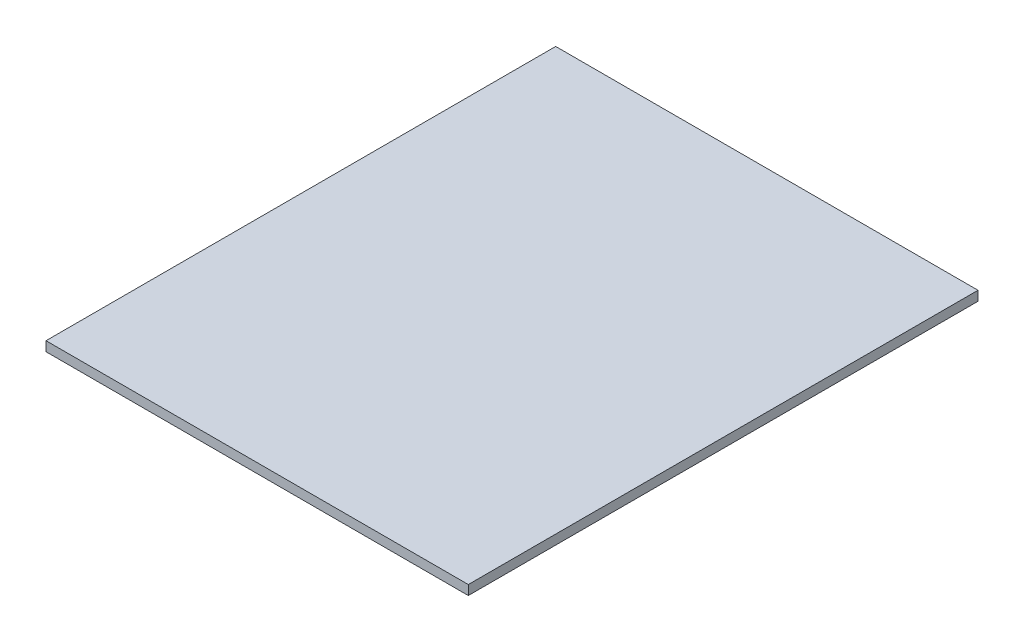
ISO-10303-21;
HEADER;
FILE_DESCRIPTION(('STEP AP214'),'2;1');
FILE_NAME('part.step','',(''),(''),'','','');
FILE_SCHEMA(('AUTOMOTIVE_DESIGN { 1 0 10303 214 1 1 1 1 }'));
ENDSEC;
DATA;
#1=APPLICATION_CONTEXT('core data for automotive mechanical design processes');
#2=APPLICATION_PROTOCOL_DEFINITION('international standard','automotive_design',2000,#1);
#3=PRODUCT_CONTEXT('',#1,'mechanical');
#4=PRODUCT('Part','Part','',(#3));
#5=PRODUCT_RELATED_PRODUCT_CATEGORY('part','',(#4));
#6=PRODUCT_DEFINITION_FORMATION('','',#4);
#7=PRODUCT_DEFINITION_CONTEXT('part definition',#1,'design');
#8=PRODUCT_DEFINITION('design','',#6,#7);
#9=PRODUCT_DEFINITION_SHAPE('','',#8);
#10=(LENGTH_UNIT() NAMED_UNIT(*) SI_UNIT(.MILLI.,.METRE.));
#11=(NAMED_UNIT(*) PLANE_ANGLE_UNIT() SI_UNIT($,.RADIAN.));
#12=(NAMED_UNIT(*) SI_UNIT($,.STERADIAN.) SOLID_ANGLE_UNIT());
#13=UNCERTAINTY_MEASURE_WITH_UNIT(LENGTH_MEASURE(1.E-05),#10,'distance_accuracy_value','');
#14=(GEOMETRIC_REPRESENTATION_CONTEXT(3) GLOBAL_UNCERTAINTY_ASSIGNED_CONTEXT((#13)) GLOBAL_UNIT_ASSIGNED_CONTEXT((#10,
#11,#12)) REPRESENTATION_CONTEXT('',''));
#15=CARTESIAN_POINT('',(0.,0.,0.));
#16=DIRECTION('',(0.,0.,1.));
#17=DIRECTION('',(1.,0.,0.));
#18=AXIS2_PLACEMENT_3D('',#15,#16,#17);
#19=CARTESIAN_POINT('',(-22.2146121372032,0.999998,-13.847691292876));
#20=DIRECTION('',(1.,0.,0.));
#21=DIRECTION('',(0.,0.,-1.));
#22=AXIS2_PLACEMENT_3D('',#19,#20,#21);
#23=PLANE('',#22);
#24=DIRECTION('',(0.,0.,1.));
#25=VECTOR('',#24,1.);
#26=CARTESIAN_POINT('',(-22.2146121372032,0.,-13.847691292876));
#27=LINE('',#26,#25);
#28=CARTESIAN_POINT('',(-22.2146121372032,0.,-13.847691292876));
#29=VERTEX_POINT('',#28);
#30=CARTESIAN_POINT('',(-22.2146121372032,0.,39.492308707124));
#31=VERTEX_POINT('',#30);
#32=EDGE_CURVE('E100',#29,#31,#27,.T.);
#33=ORIENTED_EDGE('',*,*,#32,.T.);
#34=DIRECTION('',(0.,-1.,0.));
#35=VECTOR('',#34,1.);
#36=CARTESIAN_POINT('',(-22.2146121372032,0.999998,39.492308707124));
#37=LINE('',#36,#35);
#38=CARTESIAN_POINT('',(-22.2146121372032,0.999998,39.492308707124));
#39=VERTEX_POINT('',#38);
#40=EDGE_CURVE('E11',#39,#31,#37,.T.);
#41=ORIENTED_EDGE('',*,*,#40,.F.);
#42=DIRECTION('',(0.,0.,1.));
#43=VECTOR('',#42,1.);
#44=CARTESIAN_POINT('',(-22.2146121372032,0.999998,-13.847691292876));
#45=LINE('',#44,#43);
#46=CARTESIAN_POINT('',(-22.2146121372032,0.999998,-13.847691292876));
#47=VERTEX_POINT('',#46);
#48=EDGE_CURVE('E88',#47,#39,#45,.T.);
#49=ORIENTED_EDGE('',*,*,#48,.F.);
#50=DIRECTION('',(0.,-1.,0.));
#51=VECTOR('',#50,1.);
#52=CARTESIAN_POINT('',(-22.2146121372032,0.999998,-13.847691292876));
#53=LINE('',#52,#51);
#54=EDGE_CURVE('E96',#47,#29,#53,.T.);
#55=ORIENTED_EDGE('',*,*,#54,.T.);
#56=EDGE_LOOP('',(#33,#41,#49,#55));
#57=FACE_BOUND('',#56,.T.);
#58=ADVANCED_FACE('F37',(#57),#23,.F.);
#59=CARTESIAN_POINT('',(-22.2146121372032,0.999998,39.492308707124));
#60=DIRECTION('',(0.,0.,-1.));
#61=DIRECTION('',(-1.,0.,0.));
#62=AXIS2_PLACEMENT_3D('',#59,#60,#61);
#63=PLANE('',#62);
#64=DIRECTION('',(1.,0.,0.));
#65=VECTOR('',#64,1.);
#66=CARTESIAN_POINT('',(-22.2146121372032,0.,39.492308707124));
#67=LINE('',#66,#65);
#68=CARTESIAN_POINT('',(21.9813878627968,0.,39.492308707124));
#69=VERTEX_POINT('',#68);
#70=EDGE_CURVE('E92',#31,#69,#67,.T.);
#71=ORIENTED_EDGE('',*,*,#70,.T.);
#72=DIRECTION('',(0.,-1.,0.));
#73=VECTOR('',#72,1.);
#74=CARTESIAN_POINT('',(21.9813878627968,0.999998,39.492308707124));
#75=LINE('',#74,#73);
#76=CARTESIAN_POINT('',(21.9813878627968,0.999998,39.492308707124));
#77=VERTEX_POINT('',#76);
#78=EDGE_CURVE('E45',#77,#69,#75,.T.);
#79=ORIENTED_EDGE('',*,*,#78,.F.);
#80=DIRECTION('',(1.,0.,0.));
#81=VECTOR('',#80,1.);
#82=CARTESIAN_POINT('',(-22.2146121372032,0.999998,39.492308707124));
#83=LINE('',#82,#81);
#84=EDGE_CURVE('E83',#39,#77,#83,.T.);
#85=ORIENTED_EDGE('',*,*,#84,.F.);
#86=ORIENTED_EDGE('',*,*,#40,.T.);
#87=EDGE_LOOP('',(#71,#79,#85,#86));
#88=FACE_BOUND('',#87,.T.);
#89=ADVANCED_FACE('F91',(#88),#63,.F.);
#90=CARTESIAN_POINT('',(21.9813878627968,0.999998,-13.847691292876));
#91=DIRECTION('',(-1.,0.,0.));
#92=DIRECTION('',(0.,0.,1.));
#93=AXIS2_PLACEMENT_3D('',#90,#91,#92);
#94=PLANE('',#93);
#95=DIRECTION('',(0.,0.,-1.));
#96=VECTOR('',#95,1.);
#97=CARTESIAN_POINT('',(21.9813878627968,0.,-13.847691292876));
#98=LINE('',#97,#96);
#99=CARTESIAN_POINT('',(21.9813878627968,0.,-13.847691292876));
#100=VERTEX_POINT('',#99);
#101=EDGE_CURVE('E70',#69,#100,#98,.T.);
#102=ORIENTED_EDGE('',*,*,#101,.T.);
#103=DIRECTION('',(0.,-1.,0.));
#104=VECTOR('',#103,1.);
#105=CARTESIAN_POINT('',(21.9813878627968,0.999998,-13.847691292876));
#106=LINE('',#105,#104);
#107=CARTESIAN_POINT('',(21.9813878627968,0.999998,-13.847691292876));
#108=VERTEX_POINT('',#107);
#109=EDGE_CURVE('E93',#108,#100,#106,.T.);
#110=ORIENTED_EDGE('',*,*,#109,.F.);
#111=DIRECTION('',(0.,0.,-1.));
#112=VECTOR('',#111,1.);
#113=CARTESIAN_POINT('',(21.9813878627968,0.999998,-13.847691292876));
#114=LINE('',#113,#112);
#115=EDGE_CURVE('E86',#77,#108,#114,.T.);
#116=ORIENTED_EDGE('',*,*,#115,.F.);
#117=ORIENTED_EDGE('',*,*,#78,.T.);
#118=EDGE_LOOP('',(#102,#110,#116,#117));
#119=FACE_BOUND('',#118,.T.);
#120=ADVANCED_FACE('F94',(#119),#94,.F.);
#121=CARTESIAN_POINT('',(-22.2146121372032,0.999998,-13.847691292876));
#122=DIRECTION('',(0.,0.,1.));
#123=DIRECTION('',(1.,0.,0.));
#124=AXIS2_PLACEMENT_3D('',#121,#122,#123);
#125=PLANE('',#124);
#126=DIRECTION('',(-1.,0.,0.));
#127=VECTOR('',#126,1.);
#128=CARTESIAN_POINT('',(-22.2146121372032,0.,-13.847691292876));
#129=LINE('',#128,#127);
#130=EDGE_CURVE('E76',#100,#29,#129,.T.);
#131=ORIENTED_EDGE('',*,*,#130,.T.);
#132=ORIENTED_EDGE('',*,*,#54,.F.);
#133=DIRECTION('',(-1.,0.,0.));
#134=VECTOR('',#133,1.);
#135=CARTESIAN_POINT('',(-22.2146121372032,0.999998,-13.847691292876));
#136=LINE('',#135,#134);
#137=EDGE_CURVE('E53',#108,#47,#136,.T.);
#138=ORIENTED_EDGE('',*,*,#137,.F.);
#139=ORIENTED_EDGE('',*,*,#109,.T.);
#140=EDGE_LOOP('',(#131,#132,#138,#139));
#141=FACE_BOUND('',#140,.T.);
#142=ADVANCED_FACE('F107',(#141),#125,.F.);
#143=CARTESIAN_POINT('',(0.,0.999998,0.));
#144=DIRECTION('',(0.,1.,0.));
#145=DIRECTION('',(0.,0.,1.));
#146=AXIS2_PLACEMENT_3D('',#143,#144,#145);
#147=PLANE('',#146);
#148=ORIENTED_EDGE('',*,*,#48,.T.);
#149=ORIENTED_EDGE('',*,*,#84,.T.);
#150=ORIENTED_EDGE('',*,*,#115,.T.);
#151=ORIENTED_EDGE('',*,*,#137,.T.);
#152=EDGE_LOOP('',(#148,#149,#150,#151));
#153=FACE_BOUND('',#152,.T.);
#154=ADVANCED_FACE('F84',(#153),#147,.T.);
#155=CARTESIAN_POINT('',(0.,0.,0.));
#156=DIRECTION('',(0.,1.,0.));
#157=DIRECTION('',(0.,0.,1.));
#158=AXIS2_PLACEMENT_3D('',#155,#156,#157);
#159=PLANE('',#158);
#160=ORIENTED_EDGE('',*,*,#32,.F.);
#161=ORIENTED_EDGE('',*,*,#130,.F.);
#162=ORIENTED_EDGE('',*,*,#101,.F.);
#163=ORIENTED_EDGE('',*,*,#70,.F.);
#164=EDGE_LOOP('',(#160,#161,#162,#163));
#165=FACE_BOUND('',#164,.T.);
#166=ADVANCED_FACE('F110',(#165),#159,.F.);
#167=CLOSED_SHELL('',(#58,#89,#120,#142,#154,#166));
#168=MANIFOLD_SOLID_BREP('B2',#167);
#169=ADVANCED_BREP_SHAPE_REPRESENTATION('',(#18,#168),#14);
#170=SHAPE_DEFINITION_REPRESENTATION(#9,#169);
ENDSEC;
END-ISO-10303-21;
